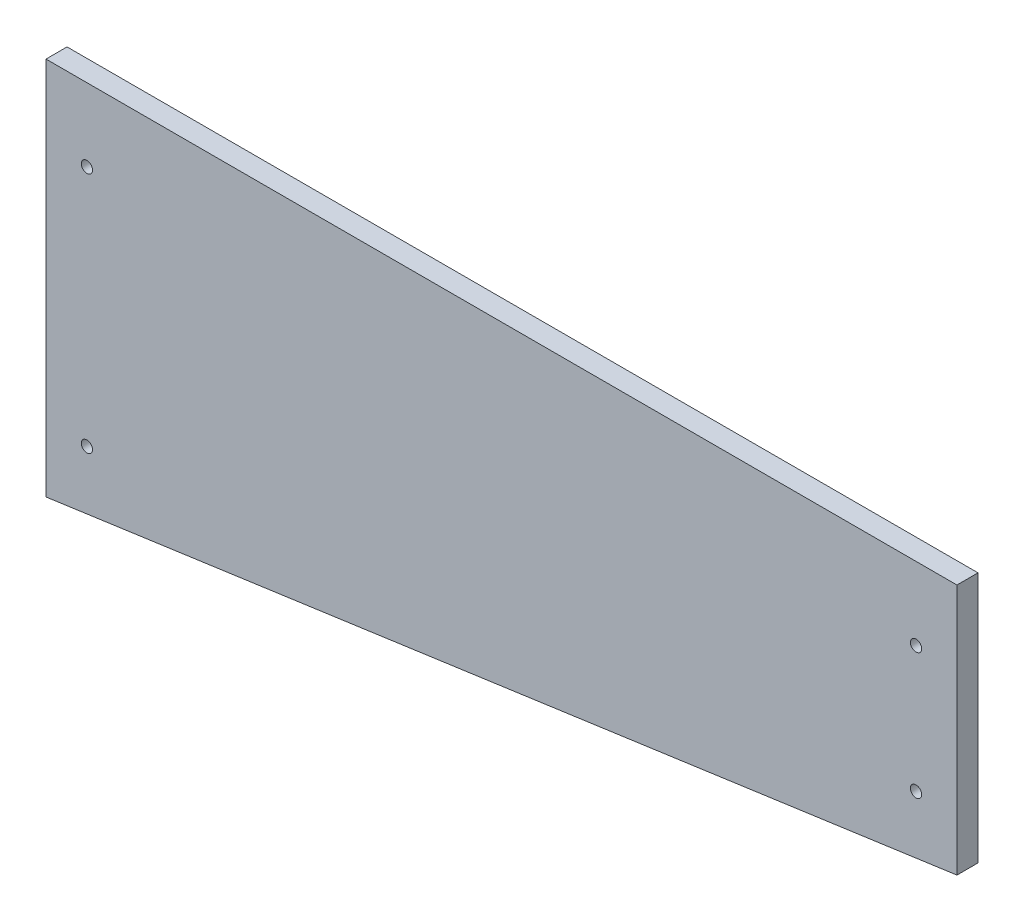
ISO-10303-21;
HEADER;
FILE_DESCRIPTION(('STEP AP214'),'2;1');
FILE_NAME('part.step','',(''),(''),'','','');
FILE_SCHEMA(('AUTOMOTIVE_DESIGN { 1 0 10303 214 1 1 1 1 }'));
ENDSEC;
DATA;
#1=APPLICATION_CONTEXT('core data for automotive mechanical design processes');
#2=APPLICATION_PROTOCOL_DEFINITION('international standard','automotive_design',2000,#1);
#3=PRODUCT_CONTEXT('',#1,'mechanical');
#4=PRODUCT('Part','Part','',(#3));
#5=PRODUCT_RELATED_PRODUCT_CATEGORY('part','',(#4));
#6=PRODUCT_DEFINITION_FORMATION('','',#4);
#7=PRODUCT_DEFINITION_CONTEXT('part definition',#1,'design');
#8=PRODUCT_DEFINITION('design','',#6,#7);
#9=PRODUCT_DEFINITION_SHAPE('','',#8);
#10=(LENGTH_UNIT() NAMED_UNIT(*) SI_UNIT(.MILLI.,.METRE.));
#11=(NAMED_UNIT(*) PLANE_ANGLE_UNIT() SI_UNIT($,.RADIAN.));
#12=(NAMED_UNIT(*) SI_UNIT($,.STERADIAN.) SOLID_ANGLE_UNIT());
#13=UNCERTAINTY_MEASURE_WITH_UNIT(LENGTH_MEASURE(1.E-05),#10,'distance_accuracy_value','');
#14=(GEOMETRIC_REPRESENTATION_CONTEXT(3) GLOBAL_UNCERTAINTY_ASSIGNED_CONTEXT((#13)) GLOBAL_UNIT_ASSIGNED_CONTEXT((#10,
#11,#12)) REPRESENTATION_CONTEXT('',''));
#15=CARTESIAN_POINT('',(0.,0.,0.));
#16=DIRECTION('',(0.,0.,1.));
#17=DIRECTION('',(1.,0.,0.));
#18=AXIS2_PLACEMENT_3D('',#15,#16,#17);
#19=CARTESIAN_POINT('',(0.,114.4016,6.35));
#20=DIRECTION('',(1.,0.,0.));
#21=DIRECTION('',(0.,1.,0.));
#22=AXIS2_PLACEMENT_3D('',#19,#20,#21);
#23=PLANE('',#22);
#24=DIRECTION('',(0.,-1.,0.));
#25=VECTOR('',#24,1.);
#26=CARTESIAN_POINT('',(0.,114.4016,0.));
#27=LINE('',#26,#25);
#28=CARTESIAN_POINT('',(0.,114.4016,0.));
#29=VERTEX_POINT('',#28);
#30=CARTESIAN_POINT('',(0.,0.,0.));
#31=VERTEX_POINT('',#30);
#32=EDGE_CURVE('E87',#29,#31,#27,.T.);
#33=ORIENTED_EDGE('',*,*,#32,.T.);
#34=DIRECTION('',(0.,0.,-1.));
#35=VECTOR('',#34,1.);
#36=CARTESIAN_POINT('',(0.,0.,6.35));
#37=LINE('',#36,#35);
#38=CARTESIAN_POINT('',(0.,0.,6.35));
#39=VERTEX_POINT('',#38);
#40=EDGE_CURVE('E11',#39,#31,#37,.T.);
#41=ORIENTED_EDGE('',*,*,#40,.F.);
#42=DIRECTION('',(0.,-1.,0.));
#43=VECTOR('',#42,1.);
#44=CARTESIAN_POINT('',(0.,114.4016,6.35));
#45=LINE('',#44,#43);
#46=CARTESIAN_POINT('',(0.,114.4016,6.35));
#47=VERTEX_POINT('',#46);
#48=EDGE_CURVE('E82',#47,#39,#45,.T.);
#49=ORIENTED_EDGE('',*,*,#48,.F.);
#50=DIRECTION('',(0.,0.,-1.));
#51=VECTOR('',#50,1.);
#52=CARTESIAN_POINT('',(0.,114.4016,6.35));
#53=LINE('',#52,#51);
#54=EDGE_CURVE('E77',#47,#29,#53,.T.);
#55=ORIENTED_EDGE('',*,*,#54,.T.);
#56=EDGE_LOOP('',(#33,#41,#49,#55));
#57=FACE_BOUND('',#56,.T.);
#58=ADVANCED_FACE('F39',(#57),#23,.F.);
#59=CARTESIAN_POINT('',(274.7772,114.4016,6.35));
#60=DIRECTION('',(-1.,0.,0.));
#61=DIRECTION('',(0.,0.,1.));
#62=AXIS2_PLACEMENT_3D('',#59,#60,#61);
#63=PLANE('',#62);
#64=DIRECTION('',(0.,1.,0.));
#65=VECTOR('',#64,1.);
#66=CARTESIAN_POINT('',(274.7772,114.4016,6.35));
#67=LINE('',#66,#65);
#68=CARTESIAN_POINT('',(274.7772,38.6174170451841,6.35));
#69=VERTEX_POINT('',#68);
#70=CARTESIAN_POINT('',(274.7772,114.4016,6.35));
#71=VERTEX_POINT('',#70);
#72=EDGE_CURVE('E109',#69,#71,#67,.T.);
#73=ORIENTED_EDGE('',*,*,#72,.F.);
#74=DIRECTION('',(0.,0.,1.));
#75=VECTOR('',#74,1.);
#76=CARTESIAN_POINT('',(274.7772,38.6174170451841,0.));
#77=LINE('',#76,#75);
#78=CARTESIAN_POINT('',(274.7772,38.6174170451841,0.));
#79=VERTEX_POINT('',#78);
#80=EDGE_CURVE('E142',#79,#69,#77,.T.);
#81=ORIENTED_EDGE('',*,*,#80,.F.);
#82=DIRECTION('',(0.,1.,0.));
#83=VECTOR('',#82,1.);
#84=CARTESIAN_POINT('',(274.7772,114.4016,0.));
#85=LINE('',#84,#83);
#86=CARTESIAN_POINT('',(274.7772,114.4016,0.));
#87=VERTEX_POINT('',#86);
#88=EDGE_CURVE('E69',#79,#87,#85,.T.);
#89=ORIENTED_EDGE('',*,*,#88,.T.);
#90=DIRECTION('',(0.,0.,-1.));
#91=VECTOR('',#90,1.);
#92=CARTESIAN_POINT('',(274.7772,114.4016,6.35));
#93=LINE('',#92,#91);
#94=EDGE_CURVE('E48',#71,#87,#93,.T.);
#95=ORIENTED_EDGE('',*,*,#94,.F.);
#96=EDGE_LOOP('',(#73,#81,#89,#95));
#97=FACE_BOUND('',#96,.T.);
#98=ADVANCED_FACE('F157',(#97),#63,.F.);
#99=CARTESIAN_POINT('',(274.7772,114.4016,6.35));
#100=DIRECTION('',(0.,-1.,0.));
#101=DIRECTION('',(1.,0.,0.));
#102=AXIS2_PLACEMENT_3D('',#99,#100,#101);
#103=PLANE('',#102);
#104=DIRECTION('',(-1.,0.,0.));
#105=VECTOR('',#104,1.);
#106=CARTESIAN_POINT('',(274.7772,114.4016,0.));
#107=LINE('',#106,#105);
#108=EDGE_CURVE('E74',#87,#29,#107,.T.);
#109=ORIENTED_EDGE('',*,*,#108,.T.);
#110=ORIENTED_EDGE('',*,*,#54,.F.);
#111=DIRECTION('',(-1.,0.,0.));
#112=VECTOR('',#111,1.);
#113=CARTESIAN_POINT('',(274.7772,114.4016,6.35));
#114=LINE('',#113,#112);
#115=EDGE_CURVE('E56',#71,#47,#114,.T.);
#116=ORIENTED_EDGE('',*,*,#115,.F.);
#117=ORIENTED_EDGE('',*,*,#94,.T.);
#118=EDGE_LOOP('',(#109,#110,#116,#117));
#119=FACE_BOUND('',#118,.T.);
#120=ADVANCED_FACE('F76',(#119),#103,.F.);
#121=CARTESIAN_POINT('',(0.,0.,6.35));
#122=DIRECTION('',(0.,0.,-1.));
#123=DIRECTION('',(-1.,0.,0.));
#124=AXIS2_PLACEMENT_3D('',#121,#122,#123);
#125=PLANE('',#124);
#126=CARTESIAN_POINT('',(12.3444,92.4052,6.35));
#127=DIRECTION('',(0.,0.,1.));
#128=DIRECTION('',(1.,0.,0.));
#129=AXIS2_PLACEMENT_3D('',#126,#127,#128);
#130=CIRCLE('',#129,1.7);
#131=CARTESIAN_POINT('',(14.0444,92.4052,6.35));
#132=VERTEX_POINT('',#131);
#133=EDGE_CURVE('E138',#132,#132,#130,.T.);
#134=ORIENTED_EDGE('',*,*,#133,.F.);
#135=EDGE_LOOP('',(#134));
#136=FACE_BOUND('',#135,.T.);
#137=CARTESIAN_POINT('',(12.3444,19.3802,6.35));
#138=DIRECTION('',(0.,0.,1.));
#139=DIRECTION('',(1.,0.,0.));
#140=AXIS2_PLACEMENT_3D('',#137,#138,#139);
#141=CIRCLE('',#140,1.7);
#142=CARTESIAN_POINT('',(14.0444,19.3802,6.35));
#143=VERTEX_POINT('',#142);
#144=EDGE_CURVE('E130',#143,#143,#141,.T.);
#145=ORIENTED_EDGE('',*,*,#144,.F.);
#146=EDGE_LOOP('',(#145));
#147=FACE_BOUND('',#146,.T.);
#148=CARTESIAN_POINT('',(262.4328,54.3052,6.35));
#149=DIRECTION('',(0.,0.,1.));
#150=DIRECTION('',(1.,0.,0.));
#151=AXIS2_PLACEMENT_3D('',#148,#149,#150);
#152=CIRCLE('',#151,1.69999999999998);
#153=CARTESIAN_POINT('',(264.1328,54.3052,6.35));
#154=VERTEX_POINT('',#153);
#155=EDGE_CURVE('E122',#154,#154,#152,.T.);
#156=ORIENTED_EDGE('',*,*,#155,.F.);
#157=EDGE_LOOP('',(#156));
#158=FACE_BOUND('',#157,.T.);
#159=CARTESIAN_POINT('',(262.4328,92.4052,6.35));
#160=DIRECTION('',(0.,0.,1.));
#161=DIRECTION('',(1.,0.,0.));
#162=AXIS2_PLACEMENT_3D('',#159,#160,#161);
#163=CIRCLE('',#162,1.69999999999998);
#164=CARTESIAN_POINT('',(264.1328,92.4052,6.35));
#165=VERTEX_POINT('',#164);
#166=EDGE_CURVE('E102',#165,#165,#163,.T.);
#167=ORIENTED_EDGE('',*,*,#166,.F.);
#168=EDGE_LOOP('',(#167));
#169=FACE_BOUND('',#168,.T.);
#170=ORIENTED_EDGE('',*,*,#48,.T.);
#171=DIRECTION('',(-0.990268068741571,-0.139173100960059,0.));
#172=VECTOR('',#171,1.);
#173=CARTESIAN_POINT('',(274.7772,38.6174170451841,6.35));
#174=LINE('',#173,#172);
#175=EDGE_CURVE('E146',#69,#39,#174,.T.);
#176=ORIENTED_EDGE('',*,*,#175,.F.);
#177=ORIENTED_EDGE('',*,*,#72,.T.);
#178=ORIENTED_EDGE('',*,*,#115,.T.);
#179=EDGE_LOOP('',(#170,#176,#177,#178));
#180=FACE_BOUND('',#179,.T.);
#181=ADVANCED_FACE('F156',(#136,#147,#158,#169,#180),#125,.F.);
#182=CARTESIAN_POINT('',(0.,0.,0.));
#183=DIRECTION('',(0.,0.,-1.));
#184=DIRECTION('',(-1.,0.,0.));
#185=AXIS2_PLACEMENT_3D('',#182,#183,#184);
#186=PLANE('',#185);
#187=DIRECTION('',(-0.990268068741571,-0.139173100960059,0.));
#188=VECTOR('',#187,1.);
#189=CARTESIAN_POINT('',(274.7772,38.6174170451841,0.));
#190=LINE('',#189,#188);
#191=EDGE_CURVE('E94',#79,#31,#190,.T.);
#192=ORIENTED_EDGE('',*,*,#191,.T.);
#193=ORIENTED_EDGE('',*,*,#32,.F.);
#194=ORIENTED_EDGE('',*,*,#108,.F.);
#195=ORIENTED_EDGE('',*,*,#88,.F.);
#196=EDGE_LOOP('',(#192,#193,#194,#195));
#197=FACE_BOUND('',#196,.T.);
#198=CARTESIAN_POINT('',(12.3444,92.4052,0.));
#199=DIRECTION('',(0.,0.,1.));
#200=DIRECTION('',(1.,0.,0.));
#201=AXIS2_PLACEMENT_3D('',#198,#199,#200);
#202=CIRCLE('',#201,1.7);
#203=CARTESIAN_POINT('',(14.0444,92.4052,0.));
#204=VERTEX_POINT('',#203);
#205=EDGE_CURVE('E134',#204,#204,#202,.T.);
#206=ORIENTED_EDGE('',*,*,#205,.T.);
#207=EDGE_LOOP('',(#206));
#208=FACE_BOUND('',#207,.T.);
#209=CARTESIAN_POINT('',(12.3444,19.3802,0.));
#210=DIRECTION('',(0.,0.,1.));
#211=DIRECTION('',(1.,0.,0.));
#212=AXIS2_PLACEMENT_3D('',#209,#210,#211);
#213=CIRCLE('',#212,1.7);
#214=CARTESIAN_POINT('',(14.0444,19.3802,0.));
#215=VERTEX_POINT('',#214);
#216=EDGE_CURVE('E126',#215,#215,#213,.T.);
#217=ORIENTED_EDGE('',*,*,#216,.T.);
#218=EDGE_LOOP('',(#217));
#219=FACE_BOUND('',#218,.T.);
#220=CARTESIAN_POINT('',(262.4328,54.3052,0.));
#221=DIRECTION('',(0.,0.,1.));
#222=DIRECTION('',(1.,0.,0.));
#223=AXIS2_PLACEMENT_3D('',#220,#221,#222);
#224=CIRCLE('',#223,1.69999999999998);
#225=CARTESIAN_POINT('',(264.1328,54.3052,0.));
#226=VERTEX_POINT('',#225);
#227=EDGE_CURVE('E118',#226,#226,#224,.T.);
#228=ORIENTED_EDGE('',*,*,#227,.T.);
#229=EDGE_LOOP('',(#228));
#230=FACE_BOUND('',#229,.T.);
#231=CARTESIAN_POINT('',(262.4328,92.4052,0.));
#232=DIRECTION('',(0.,0.,1.));
#233=DIRECTION('',(1.,0.,0.));
#234=AXIS2_PLACEMENT_3D('',#231,#232,#233);
#235=CIRCLE('',#234,1.69999999999998);
#236=CARTESIAN_POINT('',(264.1328,92.4052,0.));
#237=VERTEX_POINT('',#236);
#238=EDGE_CURVE('E96',#237,#237,#235,.T.);
#239=ORIENTED_EDGE('',*,*,#238,.T.);
#240=EDGE_LOOP('',(#239));
#241=FACE_BOUND('',#240,.T.);
#242=ADVANCED_FACE('F91',(#197,#208,#219,#230,#241),#186,.T.);
#243=CARTESIAN_POINT('',(262.4328,92.4052,6.35));
#244=DIRECTION('',(0.,0.,1.));
#245=DIRECTION('',(1.,0.,0.));
#246=AXIS2_PLACEMENT_3D('',#243,#244,#245);
#247=CYLINDRICAL_SURFACE('',#246,1.69999999999998);
#248=ORIENTED_EDGE('',*,*,#238,.F.);
#249=EDGE_LOOP('',(#248));
#250=FACE_BOUND('',#249,.T.);
#251=ORIENTED_EDGE('',*,*,#166,.T.);
#252=EDGE_LOOP('',(#251));
#253=FACE_BOUND('',#252,.T.);
#254=ADVANCED_FACE('F168',(#250,#253),#247,.F.);
#255=CARTESIAN_POINT('',(262.4328,54.3052,6.35));
#256=DIRECTION('',(0.,0.,1.));
#257=DIRECTION('',(1.,0.,0.));
#258=AXIS2_PLACEMENT_3D('',#255,#256,#257);
#259=CYLINDRICAL_SURFACE('',#258,1.69999999999998);
#260=ORIENTED_EDGE('',*,*,#227,.F.);
#261=EDGE_LOOP('',(#260));
#262=FACE_BOUND('',#261,.T.);
#263=ORIENTED_EDGE('',*,*,#155,.T.);
#264=EDGE_LOOP('',(#263));
#265=FACE_BOUND('',#264,.T.);
#266=ADVANCED_FACE('F174',(#262,#265),#259,.F.);
#267=CARTESIAN_POINT('',(12.3444,19.3802,6.35));
#268=DIRECTION('',(0.,0.,1.));
#269=DIRECTION('',(1.,0.,0.));
#270=AXIS2_PLACEMENT_3D('',#267,#268,#269);
#271=CYLINDRICAL_SURFACE('',#270,1.7);
#272=ORIENTED_EDGE('',*,*,#216,.F.);
#273=EDGE_LOOP('',(#272));
#274=FACE_BOUND('',#273,.T.);
#275=ORIENTED_EDGE('',*,*,#144,.T.);
#276=EDGE_LOOP('',(#275));
#277=FACE_BOUND('',#276,.T.);
#278=ADVANCED_FACE('F178',(#274,#277),#271,.F.);
#279=CARTESIAN_POINT('',(12.3444,92.4052,6.35));
#280=DIRECTION('',(0.,0.,1.));
#281=DIRECTION('',(1.,0.,0.));
#282=AXIS2_PLACEMENT_3D('',#279,#280,#281);
#283=CYLINDRICAL_SURFACE('',#282,1.7);
#284=ORIENTED_EDGE('',*,*,#205,.F.);
#285=EDGE_LOOP('',(#284));
#286=FACE_BOUND('',#285,.T.);
#287=ORIENTED_EDGE('',*,*,#133,.T.);
#288=EDGE_LOOP('',(#287));
#289=FACE_BOUND('',#288,.T.);
#290=ADVANCED_FACE('F182',(#286,#289),#283,.F.);
#291=CARTESIAN_POINT('',(274.7772,38.6174170451841,0.));
#292=DIRECTION('',(-0.139173100960059,0.990268068741571,0.));
#293=DIRECTION('',(-0.990268068741571,-0.139173100960059,0.));
#294=AXIS2_PLACEMENT_3D('',#291,#292,#293);
#295=PLANE('',#294);
#296=ORIENTED_EDGE('',*,*,#175,.T.);
#297=ORIENTED_EDGE('',*,*,#40,.T.);
#298=ORIENTED_EDGE('',*,*,#191,.F.);
#299=ORIENTED_EDGE('',*,*,#80,.T.);
#300=EDGE_LOOP('',(#296,#297,#298,#299));
#301=FACE_BOUND('',#300,.T.);
#302=ADVANCED_FACE('F152',(#301),#295,.F.);
#303=CLOSED_SHELL('',(#58,#98,#120,#181,#242,#254,#266,#278,#290,#302));
#304=MANIFOLD_SOLID_BREP('B2',#303);
#305=ADVANCED_BREP_SHAPE_REPRESENTATION('',(#18,#304),#14);
#306=SHAPE_DEFINITION_REPRESENTATION(#9,#305);
ENDSEC;
END-ISO-10303-21;
